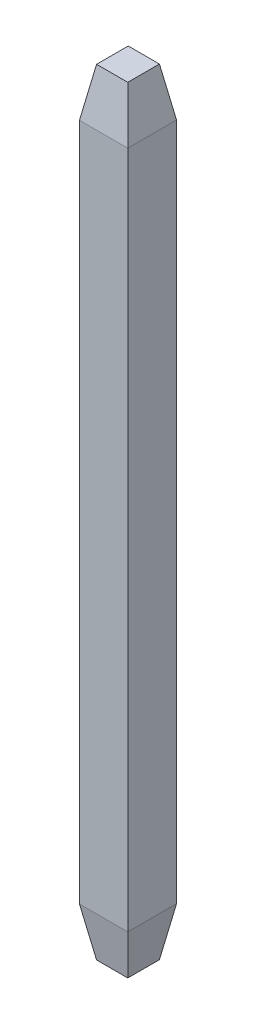
ISO-10303-21;
HEADER;
FILE_DESCRIPTION(('STEP AP214'),'2;1');
FILE_NAME('part.step','',(''),(''),'','','');
FILE_SCHEMA(('AUTOMOTIVE_DESIGN { 1 0 10303 214 1 1 1 1 }'));
ENDSEC;
DATA;
#1=APPLICATION_CONTEXT('core data for automotive mechanical design processes');
#2=APPLICATION_PROTOCOL_DEFINITION('international standard','automotive_design',2000,#1);
#3=PRODUCT_CONTEXT('',#1,'mechanical');
#4=PRODUCT('Part','Part','',(#3));
#5=PRODUCT_RELATED_PRODUCT_CATEGORY('part','',(#4));
#6=PRODUCT_DEFINITION_FORMATION('','',#4);
#7=PRODUCT_DEFINITION_CONTEXT('part definition',#1,'design');
#8=PRODUCT_DEFINITION('design','',#6,#7);
#9=PRODUCT_DEFINITION_SHAPE('','',#8);
#10=(LENGTH_UNIT() NAMED_UNIT(*) SI_UNIT(.MILLI.,.METRE.));
#11=(NAMED_UNIT(*) PLANE_ANGLE_UNIT() SI_UNIT($,.RADIAN.));
#12=(NAMED_UNIT(*) SI_UNIT($,.STERADIAN.) SOLID_ANGLE_UNIT());
#13=UNCERTAINTY_MEASURE_WITH_UNIT(LENGTH_MEASURE(1.E-05),#10,'distance_accuracy_value','');
#14=(GEOMETRIC_REPRESENTATION_CONTEXT(3) GLOBAL_UNCERTAINTY_ASSIGNED_CONTEXT((#13)) GLOBAL_UNIT_ASSIGNED_CONTEXT((#10,
#11,#12)) REPRESENTATION_CONTEXT('',''));
#15=CARTESIAN_POINT('',(0.,0.,0.));
#16=DIRECTION('',(0.,0.,1.));
#17=DIRECTION('',(1.,0.,0.));
#18=AXIS2_PLACEMENT_3D('',#15,#16,#17);
#19=CARTESIAN_POINT('',(-6.353577458752,8.,0.));
#20=DIRECTION('',(0.98480775301219,0.173648177667033,0.));
#21=DIRECTION('',(-0.173648177667033,0.98480775301219,0.));
#22=AXIS2_PLACEMENT_3D('',#19,#20,#21);
#23=PLANE('',#22);
#24=DIRECTION('',(0.171087869745612,-0.970287525247868,-0.171087869746151));
#25=VECTOR('',#24,1.);
#26=CARTESIAN_POINT('',(-6.353577458752,8.,-8.507194757183));
#27=LINE('',#26,#25);
#28=CARTESIAN_POINT('',(-6.353577458752,8.,-8.507194757183));
#29=VERTEX_POINT('',#28);
#30=CARTESIAN_POINT('',(-6.26541396839786,7.50000000000004,-8.59535824753707));
#31=VERTEX_POINT('',#30);
#32=EDGE_CURVE('E96',#29,#31,#27,.T.);
#33=ORIENTED_EDGE('',*,*,#32,.F.);
#34=DIRECTION('',(0.,0.,1.));
#35=VECTOR('',#34,1.);
#36=CARTESIAN_POINT('',(-6.353577458752,8.,0.));
#37=LINE('',#36,#35);
#38=CARTESIAN_POINT('',(-6.353577458752,8.,-8.180542211944));
#39=VERTEX_POINT('',#38);
#40=EDGE_CURVE('E20',#39,#29,#37,.F.);
#41=ORIENTED_EDGE('',*,*,#40,.F.);
#42=DIRECTION('',(-0.171087869745612,0.970287525247868,-0.171087869746151));
#43=VECTOR('',#42,1.);
#44=CARTESIAN_POINT('',(-6.265413968398,7.50000000000005,-8.09237872158972));
#45=LINE('',#44,#43);
#46=CARTESIAN_POINT('',(-6.26541396839786,7.50000000000004,-8.09237872158993));
#47=VERTEX_POINT('',#46);
#48=EDGE_CURVE('E84',#47,#39,#45,.T.);
#49=ORIENTED_EDGE('',*,*,#48,.F.);
#50=DIRECTION('',(0.,0.,1.));
#51=VECTOR('',#50,1.);
#52=CARTESIAN_POINT('',(-6.265413968398,7.5,-8.595358247537));
#53=LINE('',#52,#51);
#54=EDGE_CURVE('E119',#47,#31,#53,.F.);
#55=ORIENTED_EDGE('',*,*,#54,.T.);
#56=EDGE_LOOP('',(#33,#41,#49,#55));
#57=FACE_BOUND('',#56,.T.);
#58=ADVANCED_FACE('F17',(#57),#23,.T.);
#59=CARTESIAN_POINT('',(-6.265413968398,0.5,-8.595358247537));
#60=DIRECTION('',(-0.98480775301219,0.173648177667033,0.));
#61=DIRECTION('',(-0.173648177667033,-0.98480775301219,0.));
#62=AXIS2_PLACEMENT_3D('',#59,#60,#61);
#63=PLANE('',#62);
#64=DIRECTION('',(0.,0.,1.));
#65=VECTOR('',#64,1.);
#66=CARTESIAN_POINT('',(-6.353577458752,0.,0.));
#67=LINE('',#66,#65);
#68=CARTESIAN_POINT('',(-6.35357745875214,0.,-8.18054221194407));
#69=VERTEX_POINT('',#68);
#70=CARTESIAN_POINT('',(-6.35357745875207,0.,-8.50719475718293));
#71=VERTEX_POINT('',#70);
#72=EDGE_CURVE('E78',#69,#71,#67,.F.);
#73=ORIENTED_EDGE('',*,*,#72,.T.);
#74=DIRECTION('',(0.171087869745612,0.970287525247868,-0.171087869746151));
#75=VECTOR('',#74,1.);
#76=CARTESIAN_POINT('',(-6.353577458752,0.,-8.50719475718272));
#77=LINE('',#76,#75);
#78=CARTESIAN_POINT('',(-6.265413968398,0.5,-8.595358247537));
#79=VERTEX_POINT('',#78);
#80=EDGE_CURVE('E116',#71,#79,#77,.T.);
#81=ORIENTED_EDGE('',*,*,#80,.T.);
#82=DIRECTION('',(0.,0.,1.));
#83=VECTOR('',#82,1.);
#84=CARTESIAN_POINT('',(-6.265413968398,0.5,-8.595358247537));
#85=LINE('',#84,#83);
#86=CARTESIAN_POINT('',(-6.265413968398,0.5,-8.09237872159));
#87=VERTEX_POINT('',#86);
#88=EDGE_CURVE('E121',#79,#87,#85,.T.);
#89=ORIENTED_EDGE('',*,*,#88,.T.);
#90=DIRECTION('',(-0.171087869745612,-0.970287525247868,-0.171087869746151));
#91=VECTOR('',#90,1.);
#92=CARTESIAN_POINT('',(-6.265413968398,0.5,-8.09237872159));
#93=LINE('',#92,#91);
#94=EDGE_CURVE('E103',#87,#69,#93,.T.);
#95=ORIENTED_EDGE('',*,*,#94,.T.);
#96=EDGE_LOOP('',(#73,#81,#89,#95));
#97=FACE_BOUND('',#96,.T.);
#98=ADVANCED_FACE('F212',(#97),#63,.F.);
#99=CARTESIAN_POINT('',(0.,8.,0.));
#100=DIRECTION('',(0.,1.,0.));
#101=DIRECTION('',(0.,0.,1.));
#102=AXIS2_PLACEMENT_3D('',#99,#100,#101);
#103=PLANE('',#102);
#104=DIRECTION('',(0.,0.,1.));
#105=VECTOR('',#104,1.);
#106=CARTESIAN_POINT('',(-6.675397097871,8.,0.));
#107=LINE('',#106,#105);
#108=CARTESIAN_POINT('',(-6.675397097871,8.,-8.180542211944));
#109=VERTEX_POINT('',#108);
#110=CARTESIAN_POINT('',(-6.675397097871,8.,-8.507194757183));
#111=VERTEX_POINT('',#110);
#112=EDGE_CURVE('E102',#109,#111,#107,.F.);
#113=ORIENTED_EDGE('',*,*,#112,.F.);
#114=DIRECTION('',(1.,0.,0.));
#115=VECTOR('',#114,1.);
#116=CARTESIAN_POINT('',(0.,8.,-8.180542211944));
#117=LINE('',#116,#115);
#118=EDGE_CURVE('E89',#39,#109,#117,.F.);
#119=ORIENTED_EDGE('',*,*,#118,.F.);
#120=ORIENTED_EDGE('',*,*,#40,.T.);
#121=DIRECTION('',(1.,0.,0.));
#122=VECTOR('',#121,1.);
#123=CARTESIAN_POINT('',(0.,8.,-8.507194757183));
#124=LINE('',#123,#122);
#125=EDGE_CURVE('E112',#111,#29,#124,.T.);
#126=ORIENTED_EDGE('',*,*,#125,.F.);
#127=EDGE_LOOP('',(#113,#119,#120,#126));
#128=FACE_BOUND('',#127,.T.);
#129=ADVANCED_FACE('F101',(#128),#103,.T.);
#130=CARTESIAN_POINT('',(0.,8.,-8.180542211944));
#131=DIRECTION('',(0.,0.173648177667033,0.98480775301219));
#132=DIRECTION('',(0.,-0.98480775301219,0.173648177667033));
#133=AXIS2_PLACEMENT_3D('',#130,#131,#132);
#134=PLANE('',#133);
#135=ORIENTED_EDGE('',*,*,#48,.T.);
#136=ORIENTED_EDGE('',*,*,#118,.T.);
#137=DIRECTION('',(0.171087869746151,0.970287525247879,-0.171087869745552));
#138=VECTOR('',#137,1.);
#139=CARTESIAN_POINT('',(-6.76356058822531,7.49999999999988,-8.09237872159));
#140=LINE('',#139,#138);
#141=CARTESIAN_POINT('',(-6.76356058822583,7.49999999999999,-8.09237872158986));
#142=VERTEX_POINT('',#141);
#143=EDGE_CURVE('E124',#142,#109,#140,.T.);
#144=ORIENTED_EDGE('',*,*,#143,.F.);
#145=DIRECTION('',(-1.,0.,0.));
#146=VECTOR('',#145,1.);
#147=CARTESIAN_POINT('',(-6.763560588226,7.5,-8.09237872159));
#148=LINE('',#147,#146);
#149=EDGE_CURVE('E91',#142,#47,#148,.F.);
#150=ORIENTED_EDGE('',*,*,#149,.T.);
#151=EDGE_LOOP('',(#135,#136,#144,#150));
#152=FACE_BOUND('',#151,.T.);
#153=ADVANCED_FACE('F86',(#152),#134,.T.);
#154=CARTESIAN_POINT('',(-6.763560588226,0.5,-8.09237872159));
#155=DIRECTION('',(0.,0.173648177667033,-0.98480775301219));
#156=DIRECTION('',(0.,0.98480775301219,0.173648177667033));
#157=AXIS2_PLACEMENT_3D('',#154,#155,#156);
#158=PLANE('',#157);
#159=DIRECTION('',(-1.,0.,0.));
#160=VECTOR('',#159,1.);
#161=CARTESIAN_POINT('',(-6.763560588226,0.5,-8.09237872159));
#162=LINE('',#161,#160);
#163=CARTESIAN_POINT('',(-6.763560588226,0.5,-8.09237872159));
#164=VERTEX_POINT('',#163);
#165=EDGE_CURVE('E133',#87,#164,#162,.T.);
#166=ORIENTED_EDGE('',*,*,#165,.T.);
#167=DIRECTION('',(0.171087869746152,-0.970287525247879,-0.171087869745552));
#168=VECTOR('',#167,1.);
#169=CARTESIAN_POINT('',(-6.763560588226,0.5,-8.09237872159));
#170=LINE('',#169,#168);
#171=CARTESIAN_POINT('',(-6.67539709787117,0.,-8.18054221194414));
#172=VERTEX_POINT('',#171);
#173=EDGE_CURVE('E136',#164,#172,#170,.T.);
#174=ORIENTED_EDGE('',*,*,#173,.T.);
#175=DIRECTION('',(1.,0.,0.));
#176=VECTOR('',#175,1.);
#177=CARTESIAN_POINT('',(0.,0.,-8.180542211944));
#178=LINE('',#177,#176);
#179=EDGE_CURVE('E108',#172,#69,#178,.T.);
#180=ORIENTED_EDGE('',*,*,#179,.T.);
#181=ORIENTED_EDGE('',*,*,#94,.F.);
#182=EDGE_LOOP('',(#166,#174,#180,#181));
#183=FACE_BOUND('',#182,.T.);
#184=ADVANCED_FACE('F205',(#183),#158,.F.);
#185=CARTESIAN_POINT('',(0.,0.,0.));
#186=DIRECTION('',(0.,1.,0.));
#187=DIRECTION('',(0.,0.,1.));
#188=AXIS2_PLACEMENT_3D('',#185,#186,#187);
#189=PLANE('',#188);
#190=DIRECTION('',(0.,0.,1.));
#191=VECTOR('',#190,1.);
#192=CARTESIAN_POINT('',(-6.67539709787169,-1.21972744404619E-13,-8.595358247537));
#193=LINE('',#192,#191);
#194=CARTESIAN_POINT('',(-6.67539709787117,0.,-8.50719475718293));
#195=VERTEX_POINT('',#194);
#196=EDGE_CURVE('E139',#172,#195,#193,.F.);
#197=ORIENTED_EDGE('',*,*,#196,.T.);
#198=DIRECTION('',(1.,0.,0.));
#199=VECTOR('',#198,1.);
#200=CARTESIAN_POINT('',(-6.763560588226,0.,-8.50719475718272));
#201=LINE('',#200,#199);
#202=EDGE_CURVE('E114',#195,#71,#201,.T.);
#203=ORIENTED_EDGE('',*,*,#202,.T.);
#204=ORIENTED_EDGE('',*,*,#72,.F.);
#205=ORIENTED_EDGE('',*,*,#179,.F.);
#206=EDGE_LOOP('',(#197,#203,#204,#205));
#207=FACE_BOUND('',#206,.T.);
#208=ADVANCED_FACE('F202',(#207),#189,.F.);
#209=CARTESIAN_POINT('',(0.,8.,-8.507194757183));
#210=DIRECTION('',(0.,0.173648177667033,-0.98480775301219));
#211=DIRECTION('',(0.,0.98480775301219,0.173648177667033));
#212=AXIS2_PLACEMENT_3D('',#209,#210,#211);
#213=PLANE('',#212);
#214=DIRECTION('',(-0.171087869746151,-0.970287525247878,-0.171087869745556));
#215=VECTOR('',#214,1.);
#216=CARTESIAN_POINT('',(-6.675397097871,8.,-8.507194757183));
#217=LINE('',#216,#215);
#218=CARTESIAN_POINT('',(-6.76356058822583,7.49999999999999,-8.59535824753714));
#219=VERTEX_POINT('',#218);
#220=EDGE_CURVE('E127',#111,#219,#217,.T.);
#221=ORIENTED_EDGE('',*,*,#220,.F.);
#222=ORIENTED_EDGE('',*,*,#125,.T.);
#223=ORIENTED_EDGE('',*,*,#32,.T.);
#224=DIRECTION('',(1.,0.,0.));
#225=VECTOR('',#224,1.);
#226=CARTESIAN_POINT('',(-6.763560588226,7.5,-8.595358247537));
#227=LINE('',#226,#225);
#228=EDGE_CURVE('E144',#31,#219,#227,.F.);
#229=ORIENTED_EDGE('',*,*,#228,.T.);
#230=EDGE_LOOP('',(#221,#222,#223,#229));
#231=FACE_BOUND('',#230,.T.);
#232=ADVANCED_FACE('F176',(#231),#213,.T.);
#233=CARTESIAN_POINT('',(-6.763560588226,0.5,-8.595358247537));
#234=DIRECTION('',(0.,0.173648177667033,0.98480775301219));
#235=DIRECTION('',(0.,-0.98480775301219,0.173648177667033));
#236=AXIS2_PLACEMENT_3D('',#233,#234,#235);
#237=PLANE('',#236);
#238=ORIENTED_EDGE('',*,*,#202,.F.);
#239=DIRECTION('',(-0.171087869746152,0.970287525247878,-0.171087869745556));
#240=VECTOR('',#239,1.);
#241=CARTESIAN_POINT('',(-6.67539709787169,-1.21972744404619E-13,-8.507194757183));
#242=LINE('',#241,#240);
#243=CARTESIAN_POINT('',(-6.763560588226,0.5,-8.595358247537));
#244=VERTEX_POINT('',#243);
#245=EDGE_CURVE('E142',#195,#244,#242,.T.);
#246=ORIENTED_EDGE('',*,*,#245,.T.);
#247=DIRECTION('',(1.,0.,0.));
#248=VECTOR('',#247,1.);
#249=CARTESIAN_POINT('',(-6.763560588226,0.5,-8.595358247537));
#250=LINE('',#249,#248);
#251=EDGE_CURVE('E34',#244,#79,#250,.T.);
#252=ORIENTED_EDGE('',*,*,#251,.T.);
#253=ORIENTED_EDGE('',*,*,#80,.F.);
#254=EDGE_LOOP('',(#238,#246,#252,#253));
#255=FACE_BOUND('',#254,.T.);
#256=ADVANCED_FACE('F195',(#255),#237,.F.);
#257=CARTESIAN_POINT('',(-6.265413968398,8.,-8.595358247537));
#258=DIRECTION('',(-1.,0.,0.));
#259=DIRECTION('',(0.,0.,1.));
#260=AXIS2_PLACEMENT_3D('',#257,#258,#259);
#261=PLANE('',#260);
#262=ORIENTED_EDGE('',*,*,#88,.F.);
#263=DIRECTION('',(0.,1.,0.));
#264=VECTOR('',#263,1.);
#265=CARTESIAN_POINT('',(-6.265413968398,8.,-8.595358247537));
#266=LINE('',#265,#264);
#267=EDGE_CURVE('E148',#79,#31,#266,.T.);
#268=ORIENTED_EDGE('',*,*,#267,.T.);
#269=ORIENTED_EDGE('',*,*,#54,.F.);
#270=DIRECTION('',(0.,1.,0.));
#271=VECTOR('',#270,1.);
#272=CARTESIAN_POINT('',(-6.265413968398,8.,-8.09237872159));
#273=LINE('',#272,#271);
#274=EDGE_CURVE('E130',#47,#87,#273,.F.);
#275=ORIENTED_EDGE('',*,*,#274,.T.);
#276=EDGE_LOOP('',(#262,#268,#269,#275));
#277=FACE_BOUND('',#276,.T.);
#278=ADVANCED_FACE('F192',(#277),#261,.F.);
#279=CARTESIAN_POINT('',(-6.675397097871,8.,0.));
#280=DIRECTION('',(-0.98480775301219,0.173648177667033,0.));
#281=DIRECTION('',(-0.173648177667033,-0.98480775301219,0.));
#282=AXIS2_PLACEMENT_3D('',#279,#280,#281);
#283=PLANE('',#282);
#284=ORIENTED_EDGE('',*,*,#220,.T.);
#285=DIRECTION('',(0.,0.,-1.));
#286=VECTOR('',#285,1.);
#287=CARTESIAN_POINT('',(-6.763560588226,7.5,-8.595358247537));
#288=LINE('',#287,#286);
#289=EDGE_CURVE('E151',#219,#142,#288,.F.);
#290=ORIENTED_EDGE('',*,*,#289,.T.);
#291=ORIENTED_EDGE('',*,*,#143,.T.);
#292=ORIENTED_EDGE('',*,*,#112,.T.);
#293=EDGE_LOOP('',(#284,#290,#291,#292));
#294=FACE_BOUND('',#293,.T.);
#295=ADVANCED_FACE('F172',(#294),#283,.T.);
#296=CARTESIAN_POINT('',(-6.763560588226,8.,-8.09237872159));
#297=DIRECTION('',(0.,0.,-1.));
#298=DIRECTION('',(-1.,0.,0.));
#299=AXIS2_PLACEMENT_3D('',#296,#297,#298);
#300=PLANE('',#299);
#301=ORIENTED_EDGE('',*,*,#165,.F.);
#302=ORIENTED_EDGE('',*,*,#274,.F.);
#303=ORIENTED_EDGE('',*,*,#149,.F.);
#304=DIRECTION('',(0.,1.,0.));
#305=VECTOR('',#304,1.);
#306=CARTESIAN_POINT('',(-6.763560588226,8.,-8.09237872159));
#307=LINE('',#306,#305);
#308=EDGE_CURVE('E154',#142,#164,#307,.F.);
#309=ORIENTED_EDGE('',*,*,#308,.T.);
#310=EDGE_LOOP('',(#301,#302,#303,#309));
#311=FACE_BOUND('',#310,.T.);
#312=ADVANCED_FACE('F170',(#311),#300,.F.);
#313=CARTESIAN_POINT('',(-6.763560588226,0.5,-8.595358247537));
#314=DIRECTION('',(0.98480775301219,0.173648177667033,0.));
#315=DIRECTION('',(-0.173648177667033,0.98480775301219,0.));
#316=AXIS2_PLACEMENT_3D('',#313,#314,#315);
#317=PLANE('',#316);
#318=ORIENTED_EDGE('',*,*,#196,.F.);
#319=ORIENTED_EDGE('',*,*,#173,.F.);
#320=DIRECTION('',(0.,0.,-1.));
#321=VECTOR('',#320,1.);
#322=CARTESIAN_POINT('',(-6.763560588226,0.5,-8.595358247537));
#323=LINE('',#322,#321);
#324=EDGE_CURVE('E26',#164,#244,#323,.T.);
#325=ORIENTED_EDGE('',*,*,#324,.T.);
#326=ORIENTED_EDGE('',*,*,#245,.F.);
#327=EDGE_LOOP('',(#318,#319,#325,#326));
#328=FACE_BOUND('',#327,.T.);
#329=ADVANCED_FACE('F162',(#328),#317,.F.);
#330=CARTESIAN_POINT('',(-6.763560588226,8.,-8.595358247537));
#331=DIRECTION('',(0.,0.,1.));
#332=DIRECTION('',(1.,0.,0.));
#333=AXIS2_PLACEMENT_3D('',#330,#331,#332);
#334=PLANE('',#333);
#335=ORIENTED_EDGE('',*,*,#251,.F.);
#336=DIRECTION('',(0.,1.,0.));
#337=VECTOR('',#336,1.);
#338=CARTESIAN_POINT('',(-6.763560588226,8.,-8.595358247537));
#339=LINE('',#338,#337);
#340=EDGE_CURVE('E11',#244,#219,#339,.T.);
#341=ORIENTED_EDGE('',*,*,#340,.T.);
#342=ORIENTED_EDGE('',*,*,#228,.F.);
#343=ORIENTED_EDGE('',*,*,#267,.F.);
#344=EDGE_LOOP('',(#335,#341,#342,#343));
#345=FACE_BOUND('',#344,.T.);
#346=ADVANCED_FACE('F177',(#345),#334,.F.);
#347=CARTESIAN_POINT('',(-6.763560588226,8.,-8.595358247537));
#348=DIRECTION('',(1.,0.,0.));
#349=DIRECTION('',(0.,0.,-1.));
#350=AXIS2_PLACEMENT_3D('',#347,#348,#349);
#351=PLANE('',#350);
#352=ORIENTED_EDGE('',*,*,#324,.F.);
#353=ORIENTED_EDGE('',*,*,#308,.F.);
#354=ORIENTED_EDGE('',*,*,#289,.F.);
#355=ORIENTED_EDGE('',*,*,#340,.F.);
#356=EDGE_LOOP('',(#352,#353,#354,#355));
#357=FACE_BOUND('',#356,.T.);
#358=ADVANCED_FACE('F166',(#357),#351,.F.);
#359=CLOSED_SHELL('',(#58,#98,#129,#153,#184,#208,#232,#256,#278,#295,#312,#329,#346,#358));
#360=MANIFOLD_SOLID_BREP('B1',#359);
#361=ADVANCED_BREP_SHAPE_REPRESENTATION('',(#18,#360),#14);
#362=SHAPE_DEFINITION_REPRESENTATION(#9,#361);
ENDSEC;
END-ISO-10303-21;
